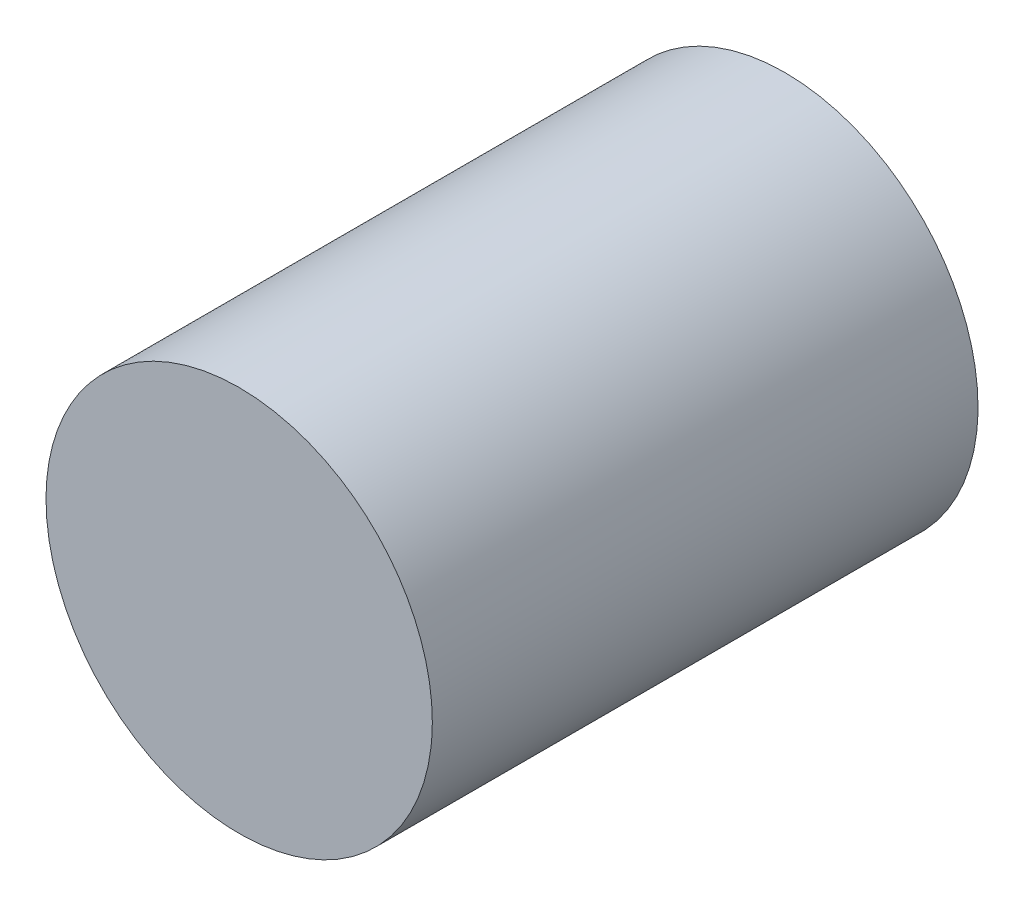
ISO-10303-21;
HEADER;
FILE_DESCRIPTION(('STEP AP214'),'2;1');
FILE_NAME('part.step','',(''),(''),'','','');
FILE_SCHEMA(('AUTOMOTIVE_DESIGN { 1 0 10303 214 1 1 1 1 }'));
ENDSEC;
DATA;
#1=APPLICATION_CONTEXT('core data for automotive mechanical design processes');
#2=APPLICATION_PROTOCOL_DEFINITION('international standard','automotive_design',2000,#1);
#3=PRODUCT_CONTEXT('',#1,'mechanical');
#4=PRODUCT('Part','Part','',(#3));
#5=PRODUCT_RELATED_PRODUCT_CATEGORY('part','',(#4));
#6=PRODUCT_DEFINITION_FORMATION('','',#4);
#7=PRODUCT_DEFINITION_CONTEXT('part definition',#1,'design');
#8=PRODUCT_DEFINITION('design','',#6,#7);
#9=PRODUCT_DEFINITION_SHAPE('','',#8);
#10=(LENGTH_UNIT() NAMED_UNIT(*) SI_UNIT(.MILLI.,.METRE.));
#11=(NAMED_UNIT(*) PLANE_ANGLE_UNIT() SI_UNIT($,.RADIAN.));
#12=(NAMED_UNIT(*) SI_UNIT($,.STERADIAN.) SOLID_ANGLE_UNIT());
#13=UNCERTAINTY_MEASURE_WITH_UNIT(LENGTH_MEASURE(1.E-05),#10,'distance_accuracy_value','');
#14=(GEOMETRIC_REPRESENTATION_CONTEXT(3) GLOBAL_UNCERTAINTY_ASSIGNED_CONTEXT((#13)) GLOBAL_UNIT_ASSIGNED_CONTEXT((#10,
#11,#12)) REPRESENTATION_CONTEXT('',''));
#15=CARTESIAN_POINT('',(0.,0.,0.));
#16=DIRECTION('',(0.,0.,1.));
#17=DIRECTION('',(1.,0.,0.));
#18=AXIS2_PLACEMENT_3D('',#15,#16,#17);
#19=CARTESIAN_POINT('',(1.475,-0.125,0.603109286057));
#20=CARTESIAN_POINT('',(1.475,0.125,0.603109286057));
#21=CARTESIAN_POINT('',(1.725,-0.125,0.603109286057));
#22=CARTESIAN_POINT('',(1.725,0.125,0.603109286057));
#23=(BOUNDED_SURFACE() B_SPLINE_SURFACE(1,1,((#19,#20),(#21,#22)),.UNSPECIFIED.,.F.,.F.,
.F.) B_SPLINE_SURFACE_WITH_KNOTS((2,2),(2,2),(-0.125,0.125),(-0.125,0.125),
.UNSPECIFIED.) GEOMETRIC_REPRESENTATION_ITEM() RATIONAL_B_SPLINE_SURFACE(((1.,1.),(1.,1.))) REPRESENTATION_ITEM('') SURFACE());
#24=CARTESIAN_POINT('',(1.725,0.,0.603109286057));
#25=CARTESIAN_POINT('',(1.725,0.216506350946,0.603109286057));
#26=CARTESIAN_POINT('',(1.5375,0.108253175473,0.603109286057));
#27=CARTESIAN_POINT('',(1.35,0.,0.603109286057));
#28=CARTESIAN_POINT('',(1.5375,-0.108253175473,0.603109286057));
#29=CARTESIAN_POINT('',(1.725,-0.216506350946,0.603109286057));
#30=CARTESIAN_POINT('',(1.725,0.,0.603109286057));
#31=(BOUNDED_CURVE() B_SPLINE_CURVE(2,(#24,#25,#26,#27,#28,#29,#30),.UNSPECIFIED.,.T.,
.F.) B_SPLINE_CURVE_WITH_KNOTS((3,2,2,3),(0.,2.094395102393,4.188790204786,6.28318530718),
.UNSPECIFIED.) CURVE() GEOMETRIC_REPRESENTATION_ITEM() RATIONAL_B_SPLINE_CURVE((1.,0.5,1.,0.5,
1.,0.5,1.)) REPRESENTATION_ITEM(''));
#32=CARTESIAN_POINT('',(1.725,0.,0.603109286057));
#33=VERTEX_POINT('',#32);
#34=EDGE_CURVE('E11',#33,#33,#31,.T.);
#35=ORIENTED_EDGE('',*,*,#34,.T.);
#36=EDGE_LOOP('',(#35));
#37=FACE_BOUND('',#36,.T.);
#38=ADVANCED_FACE('F17',(#37),#23,.T.);
#39=CARTESIAN_POINT('',(1.475,-0.125,0.25));
#40=CARTESIAN_POINT('',(1.475,0.125,0.25));
#41=CARTESIAN_POINT('',(1.725,-0.125,0.25));
#42=CARTESIAN_POINT('',(1.725,0.125,0.25));
#43=(BOUNDED_SURFACE() B_SPLINE_SURFACE(1,1,((#39,#40),(#41,#42)),.UNSPECIFIED.,.F.,.F.,
.F.) B_SPLINE_SURFACE_WITH_KNOTS((2,2),(2,2),(-0.125,0.125),(-0.125,0.125),
.UNSPECIFIED.) GEOMETRIC_REPRESENTATION_ITEM() RATIONAL_B_SPLINE_SURFACE(((1.,1.),(1.,1.))) REPRESENTATION_ITEM('') SURFACE());
#44=CARTESIAN_POINT('',(1.725,0.,0.25));
#45=CARTESIAN_POINT('',(1.725,0.216506350946,0.25));
#46=CARTESIAN_POINT('',(1.5375,0.108253175473,0.25));
#47=CARTESIAN_POINT('',(1.35,0.,0.25));
#48=CARTESIAN_POINT('',(1.5375,-0.108253175473,0.25));
#49=CARTESIAN_POINT('',(1.725,-0.216506350946,0.25));
#50=CARTESIAN_POINT('',(1.725,0.,0.25));
#51=(BOUNDED_CURVE() B_SPLINE_CURVE(2,(#44,#45,#46,#47,#48,#49,#50),.UNSPECIFIED.,.T.,
.F.) B_SPLINE_CURVE_WITH_KNOTS((3,2,2,3),(0.,2.094395102393,4.188790204786,6.28318530718),
.UNSPECIFIED.) CURVE() GEOMETRIC_REPRESENTATION_ITEM() RATIONAL_B_SPLINE_CURVE((1.,0.5,1.,0.5,
1.,0.5,1.)) REPRESENTATION_ITEM(''));
#52=CARTESIAN_POINT('',(1.725,0.,0.25));
#53=VERTEX_POINT('',#52);
#54=EDGE_CURVE('E47',#53,#53,#51,.T.);
#55=ORIENTED_EDGE('',*,*,#54,.F.);
#56=EDGE_LOOP('',(#55));
#57=FACE_BOUND('',#56,.T.);
#58=ADVANCED_FACE('F19',(#57),#43,.F.);
#59=CARTESIAN_POINT('',(1.725,0.,0.25));
#60=CARTESIAN_POINT('',(1.725,0.,0.603109286057));
#61=CARTESIAN_POINT('',(1.725,0.216506350946,0.25));
#62=CARTESIAN_POINT('',(1.725,0.216506350946,0.603109286057));
#63=CARTESIAN_POINT('',(1.5375,0.108253175473,0.25));
#64=CARTESIAN_POINT('',(1.5375,0.108253175473,0.603109286057));
#65=CARTESIAN_POINT('',(1.35,0.,0.25));
#66=CARTESIAN_POINT('',(1.35,0.,0.603109286057));
#67=CARTESIAN_POINT('',(1.5375,-0.108253175473,0.25));
#68=CARTESIAN_POINT('',(1.5375,-0.108253175473,0.603109286057));
#69=CARTESIAN_POINT('',(1.725,-0.216506350946,0.25));
#70=CARTESIAN_POINT('',(1.725,-0.216506350946,0.603109286057));
#71=CARTESIAN_POINT('',(1.725,0.,0.25));
#72=CARTESIAN_POINT('',(1.725,0.,0.603109286057));
#73=(BOUNDED_SURFACE() B_SPLINE_SURFACE(2,1,((#59,#60),(#61,#62),(#63,#64),(#65,#66),(#67,#68),
(#69,#70),(#71,#72)),.UNSPECIFIED.,.T.,.F.,.F.) B_SPLINE_SURFACE_WITH_KNOTS((3,2,2,3),(2,2),(0.,
2.094395102393,4.188790204786,6.28318530718),(0.,0.353109286057),
.UNSPECIFIED.) GEOMETRIC_REPRESENTATION_ITEM() RATIONAL_B_SPLINE_SURFACE(((1.,1.),(0.5,0.5),(1.,
1.),(0.5,0.5),(1.,1.),(0.5,0.5),(1.,1.))) REPRESENTATION_ITEM('') SURFACE());
#74=CARTESIAN_POINT('',(1.725,0.,0.25));
#75=CARTESIAN_POINT('',(1.725,0.,0.603109286057));
#76=(BOUNDED_CURVE() B_SPLINE_CURVE(1,(#74,#75),.UNSPECIFIED.,.F.,
.F.) B_SPLINE_CURVE_WITH_KNOTS((2,2),(0.,1.),
.UNSPECIFIED.) CURVE() GEOMETRIC_REPRESENTATION_ITEM() RATIONAL_B_SPLINE_CURVE((1.,1.)) REPRESENTATION_ITEM(''));
#77=EDGE_CURVE('E23',#53,#33,#76,.T.);
#78=ORIENTED_EDGE('',*,*,#54,.T.);
#79=ORIENTED_EDGE('',*,*,#77,.T.);
#80=ORIENTED_EDGE('',*,*,#34,.F.);
#81=ORIENTED_EDGE('',*,*,#77,.F.);
#82=EDGE_LOOP('',(#78,#79,#80,#81));
#83=FACE_BOUND('',#82,.T.);
#84=ADVANCED_FACE('F45',(#83),#73,.T.);
#85=CLOSED_SHELL('',(#38,#58,#84));
#86=MANIFOLD_SOLID_BREP('B1',#85);
#87=ADVANCED_BREP_SHAPE_REPRESENTATION('',(#18,#86),#14);
#88=SHAPE_DEFINITION_REPRESENTATION(#9,#87);
ENDSEC;
END-ISO-10303-21;
